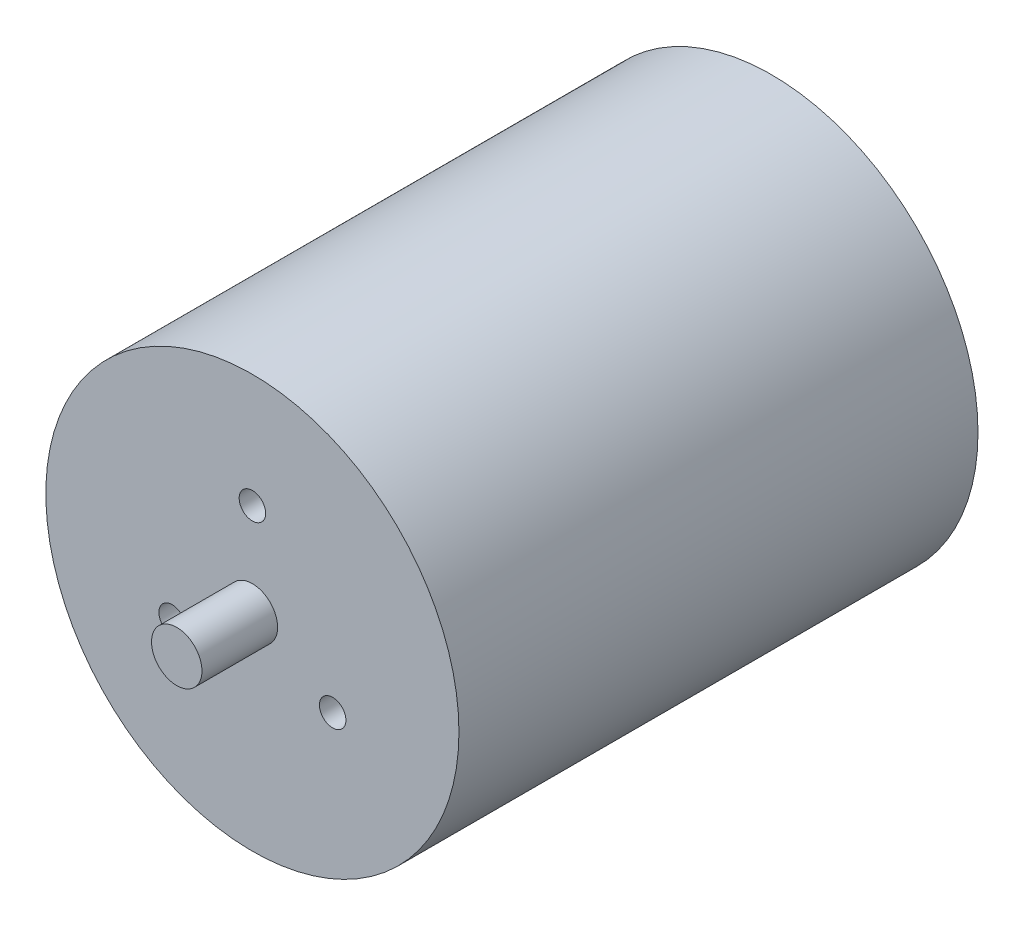
ISO-10303-21;
HEADER;
FILE_DESCRIPTION(('STEP AP214'),'2;1');
FILE_NAME('part.step','',(''),(''),'','','');
FILE_SCHEMA(('AUTOMOTIVE_DESIGN { 1 0 10303 214 1 1 1 1 }'));
ENDSEC;
DATA;
#1=APPLICATION_CONTEXT('core data for automotive mechanical design processes');
#2=APPLICATION_PROTOCOL_DEFINITION('international standard','automotive_design',2000,#1);
#3=PRODUCT_CONTEXT('',#1,'mechanical');
#4=PRODUCT('Part','Part','',(#3));
#5=PRODUCT_RELATED_PRODUCT_CATEGORY('part','',(#4));
#6=PRODUCT_DEFINITION_FORMATION('','',#4);
#7=PRODUCT_DEFINITION_CONTEXT('part definition',#1,'design');
#8=PRODUCT_DEFINITION('design','',#6,#7);
#9=PRODUCT_DEFINITION_SHAPE('','',#8);
#10=(LENGTH_UNIT() NAMED_UNIT(*) SI_UNIT(.MILLI.,.METRE.));
#11=(NAMED_UNIT(*) PLANE_ANGLE_UNIT() SI_UNIT($,.RADIAN.));
#12=(NAMED_UNIT(*) SI_UNIT($,.STERADIAN.) SOLID_ANGLE_UNIT());
#13=UNCERTAINTY_MEASURE_WITH_UNIT(LENGTH_MEASURE(1.E-05),#10,'distance_accuracy_value','');
#14=(GEOMETRIC_REPRESENTATION_CONTEXT(3) GLOBAL_UNCERTAINTY_ASSIGNED_CONTEXT((#13)) GLOBAL_UNIT_ASSIGNED_CONTEXT((#10,
#11,#12)) REPRESENTATION_CONTEXT('',''));
#15=CARTESIAN_POINT('',(0.,0.,0.));
#16=DIRECTION('',(0.,0.,1.));
#17=DIRECTION('',(1.,0.,0.));
#18=AXIS2_PLACEMENT_3D('',#15,#16,#17);
#19=CARTESIAN_POINT('',(0.,0.,98.));
#20=DIRECTION('',(0.,0.,1.));
#21=DIRECTION('',(1.,0.,0.));
#22=AXIS2_PLACEMENT_3D('',#19,#20,#21);
#23=PLANE('',#22);
#24=CARTESIAN_POINT('',(0.,17.5,98.));
#25=DIRECTION('',(0.,0.,1.));
#26=DIRECTION('',(1.,0.,0.));
#27=AXIS2_PLACEMENT_3D('',#24,#25,#26);
#28=CIRCLE('',#27,2.5);
#29=CARTESIAN_POINT('',(2.5,17.5,98.));
#30=VERTEX_POINT('',#29);
#31=EDGE_CURVE('E65',#30,#30,#28,.T.);
#32=ORIENTED_EDGE('',*,*,#31,.F.);
#33=EDGE_LOOP('',(#32));
#34=FACE_BOUND('',#33,.T.);
#35=CARTESIAN_POINT('',(15.1554445662277,-8.75,98.));
#36=DIRECTION('',(0.,0.,1.));
#37=DIRECTION('',(1.,0.,0.));
#38=AXIS2_PLACEMENT_3D('',#35,#36,#37);
#39=CIRCLE('',#38,2.5);
#40=CARTESIAN_POINT('',(17.6554445662277,-8.75,98.));
#41=VERTEX_POINT('',#40);
#42=EDGE_CURVE('E64',#41,#41,#39,.T.);
#43=ORIENTED_EDGE('',*,*,#42,.F.);
#44=EDGE_LOOP('',(#43));
#45=FACE_BOUND('',#44,.T.);
#46=CARTESIAN_POINT('',(-15.1554445662277,-8.75,98.));
#47=DIRECTION('',(0.,0.,1.));
#48=DIRECTION('',(1.,0.,0.));
#49=AXIS2_PLACEMENT_3D('',#46,#47,#48);
#50=CIRCLE('',#49,2.5);
#51=CARTESIAN_POINT('',(-12.6554445662277,-8.75,98.));
#52=VERTEX_POINT('',#51);
#53=EDGE_CURVE('E75',#52,#52,#50,.T.);
#54=ORIENTED_EDGE('',*,*,#53,.F.);
#55=EDGE_LOOP('',(#54));
#56=FACE_BOUND('',#55,.T.);
#57=CARTESIAN_POINT('',(0.,0.,98.));
#58=DIRECTION('',(0.,0.,1.));
#59=DIRECTION('',(1.,0.,0.));
#60=AXIS2_PLACEMENT_3D('',#57,#58,#59);
#61=CIRCLE('',#60,39.);
#62=CARTESIAN_POINT('',(39.,0.,98.));
#63=VERTEX_POINT('',#62);
#64=EDGE_CURVE('E11',#63,#63,#61,.T.);
#65=ORIENTED_EDGE('',*,*,#64,.T.);
#66=EDGE_LOOP('',(#65));
#67=FACE_BOUND('',#66,.T.);
#68=CARTESIAN_POINT('',(0.,0.,98.));
#69=DIRECTION('',(0.,0.,1.));
#70=DIRECTION('',(1.,0.,0.));
#71=AXIS2_PLACEMENT_3D('',#68,#69,#70);
#72=CIRCLE('',#71,4.7625);
#73=CARTESIAN_POINT('',(4.7625,0.,98.));
#74=VERTEX_POINT('',#73);
#75=EDGE_CURVE('E81',#74,#74,#72,.T.);
#76=ORIENTED_EDGE('',*,*,#75,.F.);
#77=EDGE_LOOP('',(#76));
#78=FACE_BOUND('',#77,.T.);
#79=ADVANCED_FACE('F36',(#34,#45,#56,#67,#78),#23,.T.);
#80=CARTESIAN_POINT('',(0.,0.,98.));
#81=DIRECTION('',(0.,0.,-1.));
#82=DIRECTION('',(-1.,0.,0.));
#83=AXIS2_PLACEMENT_3D('',#80,#81,#82);
#84=CYLINDRICAL_SURFACE('',#83,39.);
#85=ORIENTED_EDGE('',*,*,#64,.F.);
#86=EDGE_LOOP('',(#85));
#87=FACE_BOUND('',#86,.T.);
#88=CARTESIAN_POINT('',(0.,0.,0.));
#89=DIRECTION('',(0.,0.,1.));
#90=DIRECTION('',(1.,0.,0.));
#91=AXIS2_PLACEMENT_3D('',#88,#89,#90);
#92=CIRCLE('',#91,39.);
#93=CARTESIAN_POINT('',(39.,0.,0.));
#94=VERTEX_POINT('',#93);
#95=EDGE_CURVE('E40',#94,#94,#92,.T.);
#96=ORIENTED_EDGE('',*,*,#95,.T.);
#97=EDGE_LOOP('',(#96));
#98=FACE_BOUND('',#97,.T.);
#99=ADVANCED_FACE('F38',(#87,#98),#84,.T.);
#100=CARTESIAN_POINT('',(0.,0.,0.));
#101=DIRECTION('',(0.,0.,1.));
#102=DIRECTION('',(1.,0.,0.));
#103=AXIS2_PLACEMENT_3D('',#100,#101,#102);
#104=PLANE('',#103);
#105=ORIENTED_EDGE('',*,*,#95,.F.);
#106=EDGE_LOOP('',(#105));
#107=FACE_BOUND('',#106,.T.);
#108=ADVANCED_FACE('F96',(#107),#104,.F.);
#109=CARTESIAN_POINT('',(0.,0.,112.2875));
#110=DIRECTION('',(0.,0.,-1.));
#111=DIRECTION('',(-1.,0.,0.));
#112=AXIS2_PLACEMENT_3D('',#109,#110,#111);
#113=CYLINDRICAL_SURFACE('',#112,4.7625);
#114=CARTESIAN_POINT('',(0.,0.,112.2875));
#115=DIRECTION('',(0.,0.,1.));
#116=DIRECTION('',(1.,0.,0.));
#117=AXIS2_PLACEMENT_3D('',#114,#115,#116);
#118=CIRCLE('',#117,4.7625);
#119=CARTESIAN_POINT('',(4.7625,0.,112.2875));
#120=VERTEX_POINT('',#119);
#121=EDGE_CURVE('E82',#120,#120,#118,.T.);
#122=ORIENTED_EDGE('',*,*,#121,.F.);
#123=EDGE_LOOP('',(#122));
#124=FACE_BOUND('',#123,.T.);
#125=ORIENTED_EDGE('',*,*,#75,.T.);
#126=EDGE_LOOP('',(#125));
#127=FACE_BOUND('',#126,.T.);
#128=ADVANCED_FACE('F88',(#124,#127),#113,.T.);
#129=CARTESIAN_POINT('',(0.,0.,112.2875));
#130=DIRECTION('',(0.,0.,1.));
#131=DIRECTION('',(1.,0.,0.));
#132=AXIS2_PLACEMENT_3D('',#129,#130,#131);
#133=PLANE('',#132);
#134=ORIENTED_EDGE('',*,*,#121,.T.);
#135=EDGE_LOOP('',(#134));
#136=FACE_BOUND('',#135,.T.);
#137=ADVANCED_FACE('F107',(#136),#133,.T.);
#138=CARTESIAN_POINT('',(-15.1554445662277,-8.75,83.0013));
#139=DIRECTION('',(0.,0.,1.));
#140=DIRECTION('',(1.,0.,0.));
#141=AXIS2_PLACEMENT_3D('',#138,#139,#140);
#142=CONICAL_SURFACE('',#141,2.5,1.02974425867665);
#143=CARTESIAN_POINT('',(-15.1554445662277,-8.75,81.4991484524311));
#144=VERTEX_POINT('',#143);
#145=VERTEX_LOOP('',#144);
#146=FACE_BOUND('',#145,.T.);
#147=CARTESIAN_POINT('',(-15.1554445662277,-8.75,83.0013));
#148=DIRECTION('',(0.,0.,1.));
#149=DIRECTION('',(1.,0.,0.));
#150=AXIS2_PLACEMENT_3D('',#147,#148,#149);
#151=CIRCLE('',#150,2.5);
#152=CARTESIAN_POINT('',(-12.6554445662277,-8.75,83.0013));
#153=VERTEX_POINT('',#152);
#154=EDGE_CURVE('E78',#153,#153,#151,.T.);
#155=ORIENTED_EDGE('',*,*,#154,.T.);
#156=EDGE_LOOP('',(#155));
#157=FACE_BOUND('',#156,.T.);
#158=ADVANCED_FACE('F115',(#146,#157),#142,.F.);
#159=CARTESIAN_POINT('',(-15.1554445662277,-8.75,98.));
#160=DIRECTION('',(0.,0.,1.));
#161=DIRECTION('',(1.,0.,0.));
#162=AXIS2_PLACEMENT_3D('',#159,#160,#161);
#163=CYLINDRICAL_SURFACE('',#162,2.5);
#164=ORIENTED_EDGE('',*,*,#154,.F.);
#165=EDGE_LOOP('',(#164));
#166=FACE_BOUND('',#165,.T.);
#167=ORIENTED_EDGE('',*,*,#53,.T.);
#168=EDGE_LOOP('',(#167));
#169=FACE_BOUND('',#168,.T.);
#170=ADVANCED_FACE('F121',(#166,#169),#163,.F.);
#171=CARTESIAN_POINT('',(15.1554445662277,-8.75,83.0013));
#172=DIRECTION('',(0.,0.,1.));
#173=DIRECTION('',(1.,0.,0.));
#174=AXIS2_PLACEMENT_3D('',#171,#172,#173);
#175=CONICAL_SURFACE('',#174,2.5,1.02974425867665);
#176=CARTESIAN_POINT('',(15.1554445662277,-8.75,81.4991484524311));
#177=VERTEX_POINT('',#176);
#178=VERTEX_LOOP('',#177);
#179=FACE_BOUND('',#178,.T.);
#180=CARTESIAN_POINT('',(15.1554445662277,-8.75,83.0013));
#181=DIRECTION('',(0.,0.,1.));
#182=DIRECTION('',(1.,0.,0.));
#183=AXIS2_PLACEMENT_3D('',#180,#181,#182);
#184=CIRCLE('',#183,2.5);
#185=CARTESIAN_POINT('',(17.6554445662277,-8.75,83.0013));
#186=VERTEX_POINT('',#185);
#187=EDGE_CURVE('E68',#186,#186,#184,.T.);
#188=ORIENTED_EDGE('',*,*,#187,.T.);
#189=EDGE_LOOP('',(#188));
#190=FACE_BOUND('',#189,.T.);
#191=ADVANCED_FACE('F126',(#179,#190),#175,.F.);
#192=CARTESIAN_POINT('',(15.1554445662277,-8.75,98.));
#193=DIRECTION('',(0.,0.,1.));
#194=DIRECTION('',(1.,0.,0.));
#195=AXIS2_PLACEMENT_3D('',#192,#193,#194);
#196=CYLINDRICAL_SURFACE('',#195,2.5);
#197=ORIENTED_EDGE('',*,*,#187,.F.);
#198=EDGE_LOOP('',(#197));
#199=FACE_BOUND('',#198,.T.);
#200=ORIENTED_EDGE('',*,*,#42,.T.);
#201=EDGE_LOOP('',(#200));
#202=FACE_BOUND('',#201,.T.);
#203=ADVANCED_FACE('F58',(#199,#202),#196,.F.);
#204=CARTESIAN_POINT('',(0.,17.5,83.0013));
#205=DIRECTION('',(0.,0.,1.));
#206=DIRECTION('',(1.,0.,0.));
#207=AXIS2_PLACEMENT_3D('',#204,#205,#206);
#208=CONICAL_SURFACE('',#207,2.5,1.02974425867665);
#209=CARTESIAN_POINT('',(0.,17.5,81.4991484524311));
#210=VERTEX_POINT('',#209);
#211=VERTEX_LOOP('',#210);
#212=FACE_BOUND('',#211,.T.);
#213=CARTESIAN_POINT('',(0.,17.5,83.0013));
#214=DIRECTION('',(0.,0.,1.));
#215=DIRECTION('',(1.,0.,0.));
#216=AXIS2_PLACEMENT_3D('',#213,#214,#215);
#217=CIRCLE('',#216,2.5);
#218=CARTESIAN_POINT('',(2.5,17.5,83.0013));
#219=VERTEX_POINT('',#218);
#220=EDGE_CURVE('E62',#219,#219,#217,.T.);
#221=ORIENTED_EDGE('',*,*,#220,.T.);
#222=EDGE_LOOP('',(#221));
#223=FACE_BOUND('',#222,.T.);
#224=ADVANCED_FACE('F54',(#212,#223),#208,.F.);
#225=CARTESIAN_POINT('',(0.,17.5,98.));
#226=DIRECTION('',(0.,0.,1.));
#227=DIRECTION('',(1.,0.,0.));
#228=AXIS2_PLACEMENT_3D('',#225,#226,#227);
#229=CYLINDRICAL_SURFACE('',#228,2.5);
#230=ORIENTED_EDGE('',*,*,#220,.F.);
#231=EDGE_LOOP('',(#230));
#232=FACE_BOUND('',#231,.T.);
#233=ORIENTED_EDGE('',*,*,#31,.T.);
#234=EDGE_LOOP('',(#233));
#235=FACE_BOUND('',#234,.T.);
#236=ADVANCED_FACE('F57',(#232,#235),#229,.F.);
#237=CLOSED_SHELL('',(#79,#99,#108,#128,#137,#158,#170,#191,#203,#224,#236));
#238=MANIFOLD_SOLID_BREP('B2',#237);
#239=ADVANCED_BREP_SHAPE_REPRESENTATION('',(#18,#238),#14);
#240=SHAPE_DEFINITION_REPRESENTATION(#9,#239);
ENDSEC;
END-ISO-10303-21;
